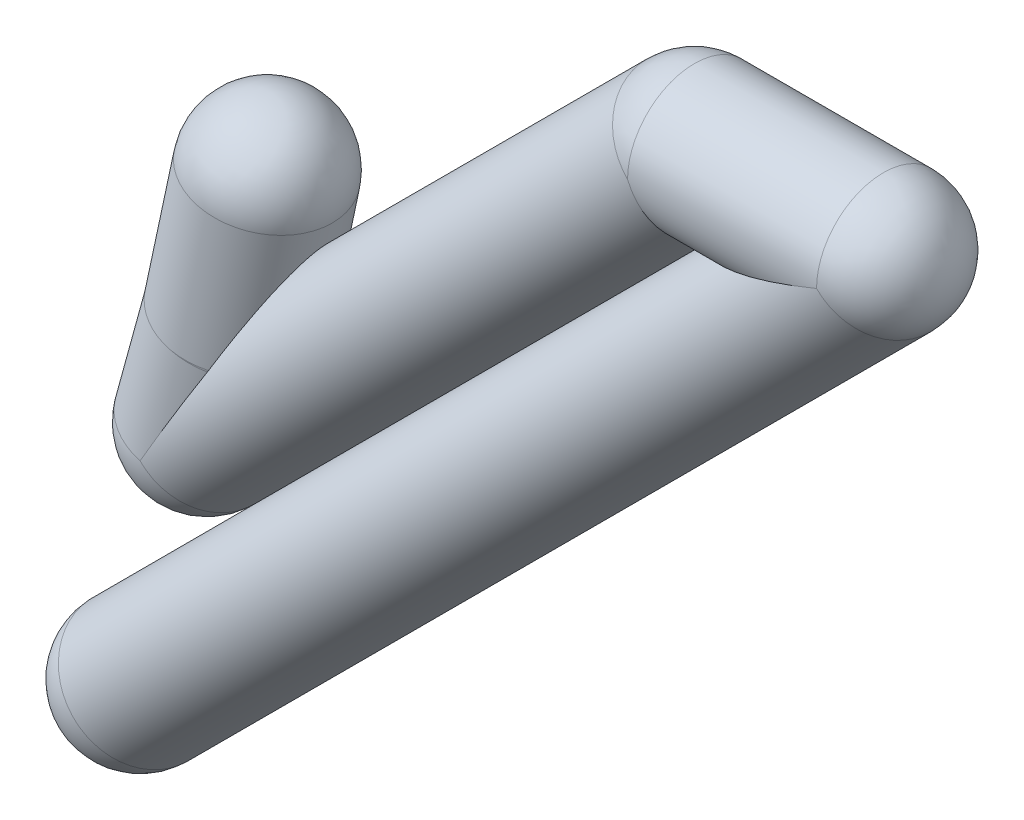
ISO-10303-21;
HEADER;
FILE_DESCRIPTION(('STEP AP214'),'2;1');
FILE_NAME('part.step','',(''),(''),'','','');
FILE_SCHEMA(('AUTOMOTIVE_DESIGN { 1 0 10303 214 1 1 1 1 }'));
ENDSEC;
DATA;
#1=APPLICATION_CONTEXT('core data for automotive mechanical design processes');
#2=APPLICATION_PROTOCOL_DEFINITION('international standard','automotive_design',2000,#1);
#3=PRODUCT_CONTEXT('',#1,'mechanical');
#4=PRODUCT('Part','Part','',(#3));
#5=PRODUCT_RELATED_PRODUCT_CATEGORY('part','',(#4));
#6=PRODUCT_DEFINITION_FORMATION('','',#4);
#7=PRODUCT_DEFINITION_CONTEXT('part definition',#1,'design');
#8=PRODUCT_DEFINITION('design','',#6,#7);
#9=PRODUCT_DEFINITION_SHAPE('','',#8);
#10=(LENGTH_UNIT() NAMED_UNIT(*) SI_UNIT(.MILLI.,.METRE.));
#11=(NAMED_UNIT(*) PLANE_ANGLE_UNIT() SI_UNIT($,.RADIAN.));
#12=(NAMED_UNIT(*) SI_UNIT($,.STERADIAN.) SOLID_ANGLE_UNIT());
#13=UNCERTAINTY_MEASURE_WITH_UNIT(LENGTH_MEASURE(1.E-05),#10,'distance_accuracy_value','');
#14=(GEOMETRIC_REPRESENTATION_CONTEXT(3) GLOBAL_UNCERTAINTY_ASSIGNED_CONTEXT((#13)) GLOBAL_UNIT_ASSIGNED_CONTEXT((#10,
#11,#12)) REPRESENTATION_CONTEXT('',''));
#15=CARTESIAN_POINT('',(0.,0.,0.));
#16=DIRECTION('',(0.,0.,1.));
#17=DIRECTION('',(1.,0.,0.));
#18=AXIS2_PLACEMENT_3D('',#15,#16,#17);
#19=CARTESIAN_POINT('',(12.435,-1.175,0.525));
#20=DIRECTION('',(1.,0.,0.));
#21=DIRECTION('',(0.,-1.,0.));
#22=AXIS2_PLACEMENT_3D('',#19,#20,#21);
#23=SPHERICAL_SURFACE('',#22,0.24);
#24=CARTESIAN_POINT('',(12.435,-1.175,0.525));
#25=DIRECTION('',(-0.706974177949316,-0.707239359561449,0.));
#26=DIRECTION('',(0.707239359561449,-0.706974177949316,0.));
#27=AXIS2_PLACEMENT_3D('',#24,#25,#26);
#28=SPHERICAL_SURFACE('',#27,0.24);
#29=CARTESIAN_POINT('',(12.435,-1.175,0.525));
#30=DIRECTION('',(-0.706974177949316,-0.707239359561449,0.));
#31=DIRECTION('',(0.707239359561449,-0.706974177949316,0.));
#32=AXIS2_PLACEMENT_3D('',#29,#30,#31);
#33=CIRCLE('',#32,0.24);
#34=CARTESIAN_POINT('',(12.6047374462947,-1.34467380270784,0.525));
#35=VERTEX_POINT('',#34);
#36=EDGE_CURVE('E191',#35,#35,#33,.F.);
#37=ORIENTED_EDGE('',*,*,#36,.F.);
#38=EDGE_LOOP('',(#37));
#39=FACE_BOUND('',#38,.T.);
#40=ADVANCED_FACE('F63',(#39),#28,.T.);
#41=CARTESIAN_POINT('',(15.101,1.492,0.525));
#42=DIRECTION('',(-0.706974177949316,-0.707239359561449,0.));
#43=DIRECTION('',(0.707239359561449,-0.706974177949316,0.));
#44=AXIS2_PLACEMENT_3D('',#41,#42,#43);
#45=CYLINDRICAL_SURFACE('',#44,0.24);
#46=CARTESIAN_POINT('',(15.101,1.492,0.525));
#47=DIRECTION('',(0.382770049801891,-0.923843649637025,0.));
#48=DIRECTION('',(-0.923843649637025,-0.382770049801891,0.));
#49=AXIS2_PLACEMENT_3D('',#46,#47,#48);
#50=ELLIPSE('',#49,0.627008304657629,0.24);
#51=CARTESIAN_POINT('',(15.101,1.492,0.285));
#52=VERTEX_POINT('',#51);
#53=CARTESIAN_POINT('',(14.5223132753196,1.25223654379976,0.51434706280173));
#54=VERTEX_POINT('',#53);
#55=EDGE_CURVE('E12',#52,#54,#50,.F.);
#56=ORIENTED_EDGE('',*,*,#55,.F.);
#57=CARTESIAN_POINT('',(15.101,1.492,0.525));
#58=DIRECTION('',(-0.706974177949316,-0.70723935956145,0.));
#59=DIRECTION('',(0.70723935956145,-0.706974177949316,0.));
#60=AXIS2_PLACEMENT_3D('',#57,#58,#59);
#61=CIRCLE('',#60,0.24);
#62=CARTESIAN_POINT('',(15.101,1.492,0.765));
#63=VERTEX_POINT('',#62);
#64=EDGE_CURVE('E227',#52,#63,#61,.T.);
#65=ORIENTED_EDGE('',*,*,#64,.T.);
#66=CARTESIAN_POINT('',(14.5223132753196,1.25223654379976,0.53565293719827));
#67=VERTEX_POINT('',#66);
#68=EDGE_CURVE('E66',#67,#63,#50,.F.);
#69=ORIENTED_EDGE('',*,*,#68,.F.);
#70=CARTESIAN_POINT('',(14.9314682197368,1.66146821379146,0.536811011603823));
#71=CARTESIAN_POINT('',(14.818342736079,1.54832151715807,0.53648822407819));
#72=CARTESIAN_POINT('',(14.7052163180331,1.43517388554659,0.536176825990138));
#73=CARTESIAN_POINT('',(14.1395818946476,0.869433392364671,0.534588605071441));
#74=CARTESIAN_POINT('',(13.6870671805128,0.416833816147703,0.533218091578876));
#75=CARTESIAN_POINT('',(13.1214537669245,-0.148885666865595,0.529969189351214));
#76=CARTESIAN_POINT('',(13.0083325481282,-0.262028099144532,0.529242620622932));
#77=CARTESIAN_POINT('',(12.8669184797733,-0.403468686771588,0.527887374108449));
#78=CARTESIAN_POINT('',(12.8386350322991,-0.431757438222424,0.527593972948655));
#79=CARTESIAN_POINT('',(12.7962215950737,-0.47417882921051,0.526911692366228));
#80=CARTESIAN_POINT('',(12.782085726174,-0.488317348999659,0.526643902030423));
#81=CARTESIAN_POINT('',(12.7608676213383,-0.509539432851651,0.526232529616032));
#82=CARTESIAN_POINT('',(12.7537925004044,-0.516615880578035,0.52609379026819));
#83=CARTESIAN_POINT('',(12.7449690660359,-0.525440969598998,0.525633277264251));
#84=CARTESIAN_POINT('',(12.7432053795274,-0.527204986850387,0.525526818522418));
#85=CARTESIAN_POINT('',(12.7405492381258,-0.529861626356359,0.525388538377581));
#86=CARTESIAN_POINT('',(12.7396619521005,-0.530749078773763,0.525346008108497));
#87=CARTESIAN_POINT('',(12.738744420125,-0.531666782813382,0.525132799293163));
#88=CARTESIAN_POINT('',(12.7386983807486,-0.531712830823511,0.525121643383809));
#89=CARTESIAN_POINT('',(12.7386088367141,-0.531802391650164,0.525096471003958));
#90=CARTESIAN_POINT('',(12.73856532422,-0.531845912304088,0.525082632514652));
#91=CARTESIAN_POINT('',(12.7385155956223,-0.531895650227423,0.525055706879124));
#92=CARTESIAN_POINT('',(12.7385073560996,-0.531903891295278,0.525050852574643));
#93=CARTESIAN_POINT('',(12.7384953540412,-0.531915895604354,0.525042721873144));
#94=CARTESIAN_POINT('',(12.7384914413275,-0.531919809051862,0.525039894731013));
#95=CARTESIAN_POINT('',(12.738483970479,-0.5319272813013,0.525033485288411));
#96=CARTESIAN_POINT('',(12.7384804083917,-0.531930844056586,0.525029913296996));
#97=CARTESIAN_POINT('',(12.7384756085464,-0.531935644802065,0.525023671017809));
#98=CARTESIAN_POINT('',(12.7384740948456,-0.531937158786741,0.52502143354888));
#99=CARTESIAN_POINT('',(12.7384712938095,-0.531939960348086,0.525016625485724));
#100=CARTESIAN_POINT('',(12.7384700110018,-0.531941243396375,0.525014049653961));
#101=CARTESIAN_POINT('',(12.7384688919098,-0.531942362698171,0.525011325119833));
#102=B_SPLINE_CURVE_WITH_KNOTS('',3,(#70,#71,#72,#73,#74,#75,#76,#77,#78,#79,#80,#81,#82,#83,
#84,#85,#86,#87,#88,#89,#90,#91,#92,#93,#94,#95,#96,#97,#98,#99,#100,#101),.UNSPECIFIED.,.F.,
.F.,(4,2,2,2,2,2,2,2,2,2,2,2,2,2,2,4),(0.,0.480000001542519,2.40000041882713,2.88000072135492,
3.00000083409713,3.0600009937003,3.09000137629971,3.09750160234522,3.1012528666637,
3.10145123988982,3.10163934379734,3.10167716448715,3.10169579358843,3.10171418019193,
3.10172343802015,3.10173286125264),.UNSPECIFIED.);
#103=CARTESIAN_POINT('',(12.8436957607435,-0.426695760743489,0.527587966649211));
#104=VERTEX_POINT('',#103);
#105=EDGE_CURVE('E190',#104,#67,#102,.F.);
#106=ORIENTED_EDGE('',*,*,#105,.F.);
#107=CARTESIAN_POINT('',(12.8439056274091,-0.426485724831392,0.522417974999879));
#108=CARTESIAN_POINT('',(12.8437558175882,-0.426635752871597,0.522407773957747));
#109=CARTESIAN_POINT('',(12.843605380402,-0.426786201255201,0.522410385210847));
#110=CARTESIAN_POINT('',(12.8433049697176,-0.42708624088367,0.522442026969652));
#111=CARTESIAN_POINT('',(12.8431550021993,-0.427235824201112,0.52247118816671));
#112=CARTESIAN_POINT('',(12.8428586155294,-0.427531067230299,0.522556888200124));
#113=CARTESIAN_POINT('',(12.8427122005311,-0.427676722369824,0.522613457599648));
#114=CARTESIAN_POINT('',(12.8424265232817,-0.427960565122965,0.522755699890893));
#115=CARTESIAN_POINT('',(12.8422872510151,-0.428098763207857,0.522841330672945));
#116=CARTESIAN_POINT('',(12.8420492256553,-0.428334684829822,0.52302222006667));
#117=CARTESIAN_POINT('',(12.841948199591,-0.428434721414624,0.523111448516408));
#118=CARTESIAN_POINT('',(12.841756798195,-0.428624095751775,0.523310503694778));
#119=CARTESIAN_POINT('',(12.8416664105508,-0.428713445874355,0.523420306222085));
#120=CARTESIAN_POINT('',(12.8415195712046,-0.428858501244034,0.523634132884425));
#121=CARTESIAN_POINT('',(12.841460050616,-0.428917262170435,0.523733958723999));
#122=CARTESIAN_POINT('',(12.8413531537831,-0.429022751060096,0.523945783771212));
#123=CARTESIAN_POINT('',(12.8413057619872,-0.429069494432809,0.524057767125078));
#124=CARTESIAN_POINT('',(12.8412328376988,-0.429141399516104,0.524273029205988));
#125=CARTESIAN_POINT('',(12.8412050033806,-0.429168835046392,0.524374760525435));
#126=CARTESIAN_POINT('',(12.8411618457487,-0.429211368603443,0.524583348138746));
#127=CARTESIAN_POINT('',(12.8411465148304,-0.429226474129414,0.524690201275545));
#128=CARTESIAN_POINT('',(12.8411294766015,-0.429243261608478,0.524906405058662));
#129=CARTESIAN_POINT('',(12.8411278129924,-0.429244900501768,0.525015762596085));
#130=CARTESIAN_POINT('',(12.8411383529091,-0.429234515978236,0.525233146125954));
#131=CARTESIAN_POINT('',(12.8411505578406,-0.4292224911765,0.525341171982303));
#132=CARTESIAN_POINT('',(12.8411870017847,-0.42918657725018,0.525547562299485));
#133=CARTESIAN_POINT('',(12.8412106349595,-0.429163285398802,0.525646141611338));
#134=CARTESIAN_POINT('',(12.8412681637254,-0.429106569872343,0.525837154699115));
#135=CARTESIAN_POINT('',(12.8413020635197,-0.429073142047562,0.525929585939064));
#136=CARTESIAN_POINT('',(12.8413932609922,-0.428983180331816,0.526141247590385));
#137=CARTESIAN_POINT('',(12.8414545417689,-0.428922705726911,0.526257090312211));
#138=CARTESIAN_POINT('',(12.8415895886472,-0.428789347624404,0.526473304368835));
#139=CARTESIAN_POINT('',(12.8416633787629,-0.428716440258149,0.526573645223073));
#140=CARTESIAN_POINT('',(12.8418493403319,-0.428532566984293,0.526793435564315));
#141=CARTESIAN_POINT('',(12.8419655613459,-0.428417549096339,0.526906051133773));
#142=CARTESIAN_POINT('',(12.8422090607881,-0.428176297011657,0.527103941762975));
#143=CARTESIAN_POINT('',(12.8423363607114,-0.428050040999553,0.527189162097231));
#144=CARTESIAN_POINT('',(12.8426425940774,-0.427745955526829,0.527358949371632));
#145=CARTESIAN_POINT('',(12.8428243050934,-0.427565247092582,0.527433339147737));
#146=CARTESIAN_POINT('',(12.8431932310079,-0.427197741072887,0.527539706716946));
#147=CARTESIAN_POINT('',(12.8433804421488,-0.427010947635521,0.527571712807345));
#148=CARTESIAN_POINT('',(12.8436806056503,-0.426710956288951,0.527590158479851));
#149=CARTESIAN_POINT('',(12.8437933070486,-0.426598207813292,0.527589703873691));
#150=CARTESIAN_POINT('',(12.843905627409,-0.426485724831483,0.527582025001836));
#151=B_SPLINE_CURVE_WITH_KNOTS('',3,(#107,#108,#109,#110,#111,#112,#113,#114,#115,#116,#117,
#118,#119,#120,#121,#122,#123,#124,#125,#126,#127,#128,#129,#130,#131,#132,#133,#134,#135,#136,
#137,#138,#139,#140,#141,#142,#143,#144,#145,#146,#147,#148,#149,#150),.UNSPECIFIED.,.F.,.F.,(4,
2,2,2,2,2,2,2,2,2,2,2,2,2,2,2,2,2,2,2,2,4),(0.,0.000636595524471061,0.00127634171523664,
0.0019168029411628,0.00255634007915401,0.00305835063383605,0.00355977433819105,
0.00394907332080322,0.00433787060860846,0.00466342029979467,0.00498877184119542,
0.0053151632968582,0.00564158783760799,0.00595234198032088,0.00626322351897469,
0.00669382772166071,0.00712526811013135,0.00771764439157067,0.00831119677115244,
0.00910760295977434,0.00990347716251675,0.0103809943925999),.UNSPECIFIED.);
#152=CARTESIAN_POINT('',(12.8436957607435,-0.426695760743489,0.522412033346073));
#153=VERTEX_POINT('',#152);
#154=EDGE_CURVE('E183',#153,#104,#151,.T.);
#155=ORIENTED_EDGE('',*,*,#154,.F.);
#156=CARTESIAN_POINT('',(14.9314682197368,1.66146821379146,0.513188988396177));
#157=CARTESIAN_POINT('',(14.818342736079,1.54832151715807,0.51351177592181));
#158=CARTESIAN_POINT('',(14.7052163180331,1.43517388554659,0.513823174009863));
#159=CARTESIAN_POINT('',(14.1395818946476,0.869433392364671,0.515411394928559));
#160=CARTESIAN_POINT('',(13.6870671805128,0.416833816147703,0.516781908421124));
#161=CARTESIAN_POINT('',(13.1214537669245,-0.148885666865595,0.520030810648786));
#162=CARTESIAN_POINT('',(13.0083325481282,-0.262028099144532,0.520757379377069));
#163=CARTESIAN_POINT('',(12.8669184797733,-0.403468686771588,0.522112625891551));
#164=CARTESIAN_POINT('',(12.8386350322991,-0.431757438222424,0.522406027051345));
#165=CARTESIAN_POINT('',(12.7962215950737,-0.47417882921051,0.523088307633773));
#166=CARTESIAN_POINT('',(12.782085726174,-0.488317348999659,0.523356097969577));
#167=CARTESIAN_POINT('',(12.7608676213383,-0.509539432851651,0.523767470383968));
#168=CARTESIAN_POINT('',(12.7537925004044,-0.516615880578035,0.52390620973181));
#169=CARTESIAN_POINT('',(12.7449690660359,-0.525440969598998,0.524366722735749));
#170=CARTESIAN_POINT('',(12.7432053795274,-0.527204986850387,0.524473181477583));
#171=CARTESIAN_POINT('',(12.7405492381258,-0.529861626356359,0.524611461622419));
#172=CARTESIAN_POINT('',(12.7396619521005,-0.530749078773763,0.524653991891503));
#173=CARTESIAN_POINT('',(12.738744420125,-0.531666782813382,0.524867200706837));
#174=CARTESIAN_POINT('',(12.7386983807486,-0.531712830823511,0.524878356616191));
#175=CARTESIAN_POINT('',(12.7386088367141,-0.531802391650164,0.524903528996042));
#176=CARTESIAN_POINT('',(12.73856532422,-0.531845912304088,0.524917367485348));
#177=CARTESIAN_POINT('',(12.7385155956223,-0.531895650227423,0.524944293120876));
#178=CARTESIAN_POINT('',(12.7385073560996,-0.531903891295278,0.524949147425357));
#179=CARTESIAN_POINT('',(12.7384953540412,-0.531915895604354,0.524957278126856));
#180=CARTESIAN_POINT('',(12.7384914413275,-0.531919809051862,0.524960105268987));
#181=CARTESIAN_POINT('',(12.738483970479,-0.5319272813013,0.52496651471159));
#182=CARTESIAN_POINT('',(12.7384804083917,-0.531930844056586,0.524970086703005));
#183=CARTESIAN_POINT('',(12.7384756085464,-0.531935644802065,0.524976328982191));
#184=CARTESIAN_POINT('',(12.7384740948456,-0.531937158786741,0.52497856645112));
#185=CARTESIAN_POINT('',(12.7384712938095,-0.531939960348086,0.524983374514276));
#186=CARTESIAN_POINT('',(12.7384700110018,-0.531941243396375,0.52498595034604));
#187=CARTESIAN_POINT('',(12.7384688919098,-0.531942362698171,0.524988674880167));
#188=B_SPLINE_CURVE_WITH_KNOTS('',3,(#156,#157,#158,#159,#160,#161,#162,#163,#164,#165,#166,
#167,#168,#169,#170,#171,#172,#173,#174,#175,#176,#177,#178,#179,#180,#181,#182,#183,#184,#185,
#186,#187),.UNSPECIFIED.,.F.,.F.,(4,2,2,2,2,2,2,2,2,2,2,2,2,2,2,4),(0.,0.480000001542519,
2.40000041882713,2.88000072135492,3.00000083409713,3.0600009937003,3.09000137629971,
3.09750160234522,3.1012528666637,3.10145123988982,3.10163934379734,3.10167716448715,
3.10169579358843,3.10171418019193,3.10172343802015,3.10173286125264),.UNSPECIFIED.);
#189=EDGE_CURVE('E77',#54,#153,#188,.T.);
#190=ORIENTED_EDGE('',*,*,#189,.F.);
#191=EDGE_LOOP('',(#56,#65,#69,#106,#155,#190));
#192=FACE_BOUND('',#191,.T.);
#193=ORIENTED_EDGE('',*,*,#36,.T.);
#194=EDGE_LOOP('',(#193));
#195=FACE_BOUND('',#194,.T.);
#196=ADVANCED_FACE('F196',(#192,#195),#45,.T.);
#197=CARTESIAN_POINT('',(15.101,1.492,0.525));
#198=DIRECTION('',(1.,0.,0.));
#199=DIRECTION('',(0.,-1.,0.));
#200=AXIS2_PLACEMENT_3D('',#197,#198,#199);
#201=SPHERICAL_SURFACE('',#200,0.24);
#202=ORIENTED_EDGE('',*,*,#64,.F.);
#203=CARTESIAN_POINT('',(15.101,1.492,0.525));
#204=DIRECTION('',(1.,0.,0.));
#205=DIRECTION('',(0.,0.,-1.));
#206=AXIS2_PLACEMENT_3D('',#203,#204,#205);
#207=CIRCLE('',#206,0.24);
#208=EDGE_CURVE('E225',#63,#52,#207,.F.);
#209=ORIENTED_EDGE('',*,*,#208,.F.);
#210=EDGE_LOOP('',(#202,#209));
#211=FACE_BOUND('',#210,.T.);
#212=ADVANCED_FACE('F200',(#211),#201,.T.);
#213=CARTESIAN_POINT('',(14.423,1.492,0.525));
#214=DIRECTION('',(1.,0.,0.));
#215=DIRECTION('',(0.,0.,-1.));
#216=AXIS2_PLACEMENT_3D('',#213,#214,#215);
#217=CYLINDRICAL_SURFACE('',#216,0.24);
#218=ORIENTED_EDGE('',*,*,#208,.T.);
#219=ORIENTED_EDGE('',*,*,#55,.T.);
#220=CARTESIAN_POINT('',(14.423,1.492,0.525));
#221=DIRECTION('',(0.923879532511287,0.38268343236509,0.));
#222=DIRECTION('',(0.38268343236509,-0.923879532511287,0.));
#223=AXIS2_PLACEMENT_3D('',#220,#221,#222);
#224=ELLIPSE('',#223,0.259774128070175,0.24);
#225=CARTESIAN_POINT('',(14.423,1.492,0.285));
#226=VERTEX_POINT('',#225);
#227=EDGE_CURVE('E224',#226,#54,#224,.F.);
#228=ORIENTED_EDGE('',*,*,#227,.F.);
#229=CARTESIAN_POINT('',(14.423,1.492,0.525));
#230=DIRECTION('',(1.,0.,0.));
#231=DIRECTION('',(0.,0.,-1.));
#232=AXIS2_PLACEMENT_3D('',#229,#230,#231);
#233=CIRCLE('',#232,0.24);
#234=CARTESIAN_POINT('',(14.423,1.492,0.765));
#235=VERTEX_POINT('',#234);
#236=EDGE_CURVE('E222',#226,#235,#233,.T.);
#237=ORIENTED_EDGE('',*,*,#236,.T.);
#238=EDGE_CURVE('E213',#67,#235,#224,.F.);
#239=ORIENTED_EDGE('',*,*,#238,.F.);
#240=ORIENTED_EDGE('',*,*,#68,.T.);
#241=EDGE_LOOP('',(#218,#219,#228,#237,#239,#240));
#242=FACE_BOUND('',#241,.T.);
#243=ADVANCED_FACE('F219',(#242),#217,.T.);
#244=CARTESIAN_POINT('',(14.423,1.492,0.525));
#245=DIRECTION('',(1.,0.,0.));
#246=DIRECTION('',(0.,-1.,0.));
#247=AXIS2_PLACEMENT_3D('',#244,#245,#246);
#248=SPHERICAL_SURFACE('',#247,0.24);
#249=ORIENTED_EDGE('',*,*,#236,.F.);
#250=CARTESIAN_POINT('',(14.423,1.492,0.525));
#251=DIRECTION('',(0.707106781186548,0.707106781186547,0.));
#252=DIRECTION('',(-0.707106781186547,0.707106781186548,0.));
#253=AXIS2_PLACEMENT_3D('',#250,#251,#252);
#254=CIRCLE('',#253,0.24);
#255=EDGE_CURVE('E334',#235,#226,#254,.F.);
#256=ORIENTED_EDGE('',*,*,#255,.F.);
#257=EDGE_LOOP('',(#249,#256));
#258=FACE_BOUND('',#257,.T.);
#259=ADVANCED_FACE('F253',(#258),#248,.T.);
#260=CARTESIAN_POINT('',(12.674,-0.257,0.525));
#261=DIRECTION('',(0.707106781186548,0.707106781186547,0.));
#262=DIRECTION('',(-0.707106781186547,0.707106781186548,0.));
#263=AXIS2_PLACEMENT_3D('',#260,#261,#262);
#264=CYLINDRICAL_SURFACE('',#263,0.24);
#265=ORIENTED_EDGE('',*,*,#227,.T.);
#266=ORIENTED_EDGE('',*,*,#189,.T.);
#267=CARTESIAN_POINT('',(12.674,-0.257,0.525));
#268=DIRECTION('',(0.707106781186548,0.707106781186547,0.));
#269=DIRECTION('',(-0.707106781186547,0.707106781186548,0.));
#270=AXIS2_PLACEMENT_3D('',#267,#268,#269);
#271=CIRCLE('',#270,0.24);
#272=CARTESIAN_POINT('',(12.674,-0.257000000000007,0.285));
#273=VERTEX_POINT('',#272);
#274=EDGE_CURVE('E154',#153,#273,#271,.T.);
#275=ORIENTED_EDGE('',*,*,#274,.T.);
#276=CARTESIAN_POINT('',(12.674,-0.256999999999998,0.525));
#277=DIRECTION('',(0.864803643058402,-0.502110205983624,0.));
#278=DIRECTION('',(0.502110205983623,0.864803643058402,0.));
#279=AXIS2_PLACEMENT_3D('',#276,#277,#278);
#280=ELLIPSE('',#279,0.935807545090937,0.24);
#281=CARTESIAN_POINT('',(12.8888696431356,0.113078217789852,0.311563477406266));
#282=VERTEX_POINT('',#281);
#283=EDGE_CURVE('E357',#282,#273,#280,.F.);
#284=ORIENTED_EDGE('',*,*,#283,.F.);
#285=CARTESIAN_POINT('',(12.9186698671729,0.192296705124994,0.333521728139037));
#286=CARTESIAN_POINT('',(12.916281423366,0.181329920028388,0.328935527130275));
#287=CARTESIAN_POINT('',(12.913274209106,0.170182861785299,0.325042652123825));
#288=CARTESIAN_POINT('',(12.9058847816894,0.148303257976919,0.318606036165927));
#289=CARTESIAN_POINT('',(12.9015399345813,0.137567426350744,0.316030161871049));
#290=CARTESIAN_POINT('',(12.8921572469805,0.118537115963306,0.312329859268076));
#291=CARTESIAN_POINT('',(12.8873816506484,0.110148990592028,0.311028395358101));
#292=CARTESIAN_POINT('',(12.8766137661474,0.0938481533453814,0.309090899036354));
#293=CARTESIAN_POINT('',(12.870597476243,0.0859495819526134,0.308469810951777));
#294=CARTESIAN_POINT('',(12.8639989504067,0.0785286335063749,0.308180822646033));
#295=B_SPLINE_CURVE_WITH_KNOTS('',3,(#285,#286,#287,#288,#289,#290,#291,#292,#293,#294),
.UNSPECIFIED.,.F.,.F.,(4,2,2,2,4),(0.,0.0363773611805648,0.0718188172288339,0.100932264135757,
0.13067310079251),.UNSPECIFIED.);
#296=CARTESIAN_POINT('',(12.892005467653,0.118657415007651,0.312460752453492));
#297=VERTEX_POINT('',#296);
#298=EDGE_CURVE('E130',#297,#282,#295,.T.);
#299=ORIENTED_EDGE('',*,*,#298,.F.);
#300=CARTESIAN_POINT('',(12.7039768637532,-0.22702313624679,0.525));
#301=DIRECTION('',(0.878455208795632,-0.477824702312284,0.));
#302=DIRECTION('',(0.477824702312283,0.878455208795632,0.));
#303=AXIS2_PLACEMENT_3D('',#300,#301,#302);
#304=ELLIPSE('',#303,0.847192736141898,0.24);
#305=CARTESIAN_POINT('',(12.892005467653,0.118657415007651,0.737539247546508));
#306=VERTEX_POINT('',#305);
#307=EDGE_CURVE('E145',#306,#297,#304,.F.);
#308=ORIENTED_EDGE('',*,*,#307,.F.);
#309=CARTESIAN_POINT('',(12.8639989504067,0.0785286335063739,0.741819177353964));
#310=CARTESIAN_POINT('',(12.8720590277675,0.0875711131736288,0.741464708433878));
#311=CARTESIAN_POINT('',(12.8792302376777,0.0973286286637633,0.740619516833243));
#312=CARTESIAN_POINT('',(12.8917102472891,0.117502746087181,0.737883994505503));
#313=CARTESIAN_POINT('',(12.8970611838446,0.127896727691657,0.736020362886681));
#314=CARTESIAN_POINT('',(12.9054230022826,0.147252121124659,0.73159290327238));
#315=CARTESIAN_POINT('',(12.908678223025,0.15615178585341,0.729205051359772));
#316=CARTESIAN_POINT('',(12.9143270320644,0.174170152269831,0.723538820145746));
#317=CARTESIAN_POINT('',(12.9167008151692,0.183289485662216,0.720242575230994));
#318=CARTESIAN_POINT('',(12.9186698671729,0.192296705124995,0.716478271860964));
#319=B_SPLINE_CURVE_WITH_KNOTS('',3,(#309,#310,#311,#312,#313,#314,#315,#316,#317,#318),
.UNSPECIFIED.,.F.,.F.,(4,2,2,2,4),(0.,0.0362348954263537,0.0715625061213349,0.100803009624681,
0.130665621374331),.UNSPECIFIED.);
#320=CARTESIAN_POINT('',(12.8888696431339,0.113078217790495,0.738436522592856));
#321=VERTEX_POINT('',#320);
#322=EDGE_CURVE('E337',#321,#306,#319,.T.);
#323=ORIENTED_EDGE('',*,*,#322,.F.);
#324=CARTESIAN_POINT('',(12.674,-0.257000000000007,0.765));
#325=VERTEX_POINT('',#324);
#326=EDGE_CURVE('E358',#325,#321,#280,.F.);
#327=ORIENTED_EDGE('',*,*,#326,.F.);
#328=EDGE_CURVE('E216',#325,#104,#271,.T.);
#329=ORIENTED_EDGE('',*,*,#328,.T.);
#330=ORIENTED_EDGE('',*,*,#105,.T.);
#331=ORIENTED_EDGE('',*,*,#238,.T.);
#332=ORIENTED_EDGE('',*,*,#255,.T.);
#333=EDGE_LOOP('',(#265,#266,#275,#284,#299,#308,#323,#327,#329,#330,#331,#332));
#334=FACE_BOUND('',#333,.T.);
#335=ADVANCED_FACE('F178',(#334),#264,.T.);
#336=CARTESIAN_POINT('',(12.674,-0.257,0.525));
#337=DIRECTION('',(1.,0.,0.));
#338=DIRECTION('',(0.,-1.,0.));
#339=AXIS2_PLACEMENT_3D('',#336,#337,#338);
#340=SPHERICAL_SURFACE('',#339,0.24);
#341=ORIENTED_EDGE('',*,*,#274,.F.);
#342=ORIENTED_EDGE('',*,*,#154,.T.);
#343=ORIENTED_EDGE('',*,*,#328,.F.);
#344=CARTESIAN_POINT('',(12.674,-0.257,0.525));
#345=DIRECTION('',(-0.263526527056736,-0.964652149501267,0.));
#346=DIRECTION('',(0.964652149501267,-0.263526527056737,0.));
#347=AXIS2_PLACEMENT_3D('',#344,#345,#346);
#348=CIRCLE('',#347,0.24);
#349=EDGE_CURVE('E134',#273,#325,#348,.F.);
#350=ORIENTED_EDGE('',*,*,#349,.F.);
#351=EDGE_LOOP('',(#341,#342,#343,#350));
#352=FACE_BOUND('',#351,.T.);
#353=ADVANCED_FACE('F174',(#352),#340,.T.);
#354=CARTESIAN_POINT('',(12.783,0.142,0.525));
#355=DIRECTION('',(1.,0.,0.));
#356=DIRECTION('',(0.,-1.,0.));
#357=AXIS2_PLACEMENT_3D('',#354,#355,#356);
#358=SPHERICAL_SURFACE('',#357,0.24);
#359=CARTESIAN_POINT('',(12.783,0.142000000000001,0.525));
#360=DIRECTION('',(-0.209394180223832,-0.977831313309402,0.));
#361=DIRECTION('',(0.977831313309402,-0.209394180223832,0.));
#362=AXIS2_PLACEMENT_3D('',#359,#360,#361);
#363=CIRCLE('',#362,0.24);
#364=CARTESIAN_POINT('',(12.783,0.142000000000002,0.285));
#365=VERTEX_POINT('',#364);
#366=EDGE_CURVE('E129',#365,#297,#363,.T.);
#367=ORIENTED_EDGE('',*,*,#366,.T.);
#368=ORIENTED_EDGE('',*,*,#298,.T.);
#369=CARTESIAN_POINT('',(12.783,0.142,0.525));
#370=DIRECTION('',(-0.263526527056733,-0.964652149501268,0.));
#371=DIRECTION('',(0.964652149501268,-0.263526527056733,0.));
#372=AXIS2_PLACEMENT_3D('',#369,#370,#371);
#373=CIRCLE('',#372,0.24);
#374=EDGE_CURVE('E126',#365,#282,#373,.T.);
#375=ORIENTED_EDGE('',*,*,#374,.F.);
#376=EDGE_LOOP('',(#367,#368,#375));
#377=FACE_BOUND('',#376,.T.);
#378=ADVANCED_FACE('F128',(#377),#358,.T.);
#379=CARTESIAN_POINT('',(12.783,0.142,0.525));
#380=DIRECTION('',(-0.263526527056736,-0.964652149501267,0.));
#381=DIRECTION('',(0.964652149501267,-0.263526527056737,0.));
#382=AXIS2_PLACEMENT_3D('',#379,#380,#381);
#383=CYLINDRICAL_SURFACE('',#382,0.24);
#384=ORIENTED_EDGE('',*,*,#349,.T.);
#385=ORIENTED_EDGE('',*,*,#326,.T.);
#386=CARTESIAN_POINT('',(12.783,0.142000000000003,0.765));
#387=VERTEX_POINT('',#386);
#388=EDGE_CURVE('E135',#321,#387,#373,.T.);
#389=ORIENTED_EDGE('',*,*,#388,.T.);
#390=CARTESIAN_POINT('',(12.783,0.141999999999934,0.765));
#391=CARTESIAN_POINT('',(12.7791830228406,0.142929288602152,0.765000083419049));
#392=CARTESIAN_POINT('',(12.7753664563857,0.143860236183995,0.764903622430109));
#393=CARTESIAN_POINT('',(12.7677433474358,0.145722938239255,0.764518201076695));
#394=CARTESIAN_POINT('',(12.7639368047073,0.146654692693196,0.764229245235575));
#395=CARTESIAN_POINT('',(12.756342851871,0.148516520161334,0.763459432320267));
#396=CARTESIAN_POINT('',(12.7525554413301,0.149446593213286,0.762978579610219));
#397=CARTESIAN_POINT('',(12.7450088120424,0.15130258306231,0.76182615784031));
#398=CARTESIAN_POINT('',(12.7412495926778,0.152228499950303,0.761154592973349));
#399=CARTESIAN_POINT('',(12.7337683406453,0.154073720214874,0.759622357882481));
#400=CARTESIAN_POINT('',(12.7300463071896,0.154993023731418,0.758761691672949));
#401=CARTESIAN_POINT('',(12.7226483340502,0.156822583989213,0.75685332939216));
#402=CARTESIAN_POINT('',(12.7189723934245,0.15773284091526,0.755805637149655));
#403=CARTESIAN_POINT('',(12.7116754042407,0.159541904444929,0.753525746472728));
#404=CARTESIAN_POINT('',(12.708054354602,0.160440711273907,0.752293551675715));
#405=CARTESIAN_POINT('',(12.7008758155775,0.162224506606278,0.749647624688708));
#406=CARTESIAN_POINT('',(12.6973183249883,0.163109495371271,0.74823389594014));
#407=CARTESIAN_POINT('',(12.6902754212913,0.16486332781127,0.745228307012126));
#408=CARTESIAN_POINT('',(12.6867900068731,0.165732171779777,0.743636450074637));
#409=CARTESIAN_POINT('',(12.6798996012623,0.167451434709113,0.740278439906012));
#410=CARTESIAN_POINT('',(12.6764946086682,0.168301853991001,0.738512289715015));
#411=CARTESIAN_POINT('',(12.6697732008618,0.169982039967856,0.73480994805352));
#412=CARTESIAN_POINT('',(12.6664567841729,0.17081180700711,0.732873759420127));
#413=CARTESIAN_POINT('',(12.6599204711013,0.172448518624439,0.728836005529195));
#414=CARTESIAN_POINT('',(12.6567005731825,0.173255463565734,0.726734442905634));
#415=CARTESIAN_POINT('',(12.6503650102088,0.174844424045149,0.722371004088562));
#416=CARTESIAN_POINT('',(12.6472493435738,0.175626439961172,0.720109130326907));
#417=CARTESIAN_POINT('',(12.6411297067789,0.177163503456031,0.715430518489854));
#418=CARTESIAN_POINT('',(12.6381257350101,0.177918551423276,0.713013782646284));
#419=CARTESIAN_POINT('',(12.6322366846319,0.179399713006405,0.708031268974996));
#420=CARTESIAN_POINT('',(12.6293516043999,0.180125827017115,0.70546549318223));
#421=CARTESIAN_POINT('',(12.6237072495158,0.181547232329023,0.700191080988545));
#422=CARTESIAN_POINT('',(12.6209479732421,0.182242524027481,0.697482446429884));
#423=CARTESIAN_POINT('',(12.6155618377789,0.183600478561854,0.691928842234759));
#424=CARTESIAN_POINT('',(12.6129349769829,0.184263141793598,0.689083874253042));
#425=CARTESIAN_POINT('',(12.6078199671365,0.185554119797685,0.683264457175417));
#426=CARTESIAN_POINT('',(12.6053318165082,0.186182434960699,0.680290009552893));
#427=CARTESIAN_POINT('',(12.6005001896513,0.18740308792916,0.674218799078226));
#428=CARTESIAN_POINT('',(12.5981567118866,0.187995426116547,0.671122037525176));
#429=CARTESIAN_POINT('',(12.5936200470398,0.189142590858297,0.664813659731274));
#430=CARTESIAN_POINT('',(12.5914268584759,0.189697417782462,0.661602044623177));
#431=CARTESIAN_POINT('',(12.5871960284126,0.190768124041073,0.655071696944691));
#432=CARTESIAN_POINT('',(12.5851583854977,0.191284003729959,0.65175296534951));
#433=CARTESIAN_POINT('',(12.5812435305511,0.19227548133927,0.645016379965987));
#434=CARTESIAN_POINT('',(12.579366317181,0.192751079595743,0.641598527004881));
#435=CARTESIAN_POINT('',(12.5757768208146,0.193660765153433,0.634671932940563));
#436=CARTESIAN_POINT('',(12.5740645365673,0.194094852769481,0.631163192526928));
#437=CARTESIAN_POINT('',(12.5708090027695,0.194920395812528,0.624063276553613));
#438=CARTESIAN_POINT('',(12.5692657520652,0.195311851530537,0.620472101556844));
#439=CARTESIAN_POINT('',(12.5663519846217,0.196051120197691,0.61321596799399));
#440=CARTESIAN_POINT('',(12.5649814668345,0.19639893341165,0.609551009875765));
#441=CARTESIAN_POINT('',(12.5624164505283,0.197050019579271,0.602156139384686));
#442=CARTESIAN_POINT('',(12.5612219510747,0.197353292769416,0.598426227356821));
#443=CARTESIAN_POINT('',(12.5590118348588,0.197914516648313,0.590910434828244));
#444=CARTESIAN_POINT('',(12.5579962172824,0.198172467543331,0.587124554582332));
#445=CARTESIAN_POINT('',(12.5561462994667,0.198642381725523,0.579505946218764));
#446=CARTESIAN_POINT('',(12.5553119985398,0.19885434518711,0.575673218278841));
#447=CARTESIAN_POINT('',(12.5538267140271,0.199231738132755,0.56797014797514));
#448=CARTESIAN_POINT('',(12.5531757298851,0.199397167758003,0.564099805725525));
#449=CARTESIAN_POINT('',(12.5520586394869,0.199681066714105,0.556330830852762));
#450=CARTESIAN_POINT('',(12.5515925328099,0.199799536151824,0.552432198294012));
#451=CARTESIAN_POINT('',(12.5508463146678,0.199989209495681,0.544616034993137));
#452=CARTESIAN_POINT('',(12.5505662029206,0.200060413473526,0.540698504279691));
#453=CARTESIAN_POINT('',(12.5501926460551,0.200155372475272,0.532853982372712));
#454=CARTESIAN_POINT('',(12.5500992007952,0.200179127535167,0.528926991186356));
#455=CARTESIAN_POINT('',(12.5500992007952,0.200179127535167,0.521073008813644));
#456=CARTESIAN_POINT('',(12.5501926460551,0.200155372475272,0.517146017627289));
#457=CARTESIAN_POINT('',(12.5505662029206,0.200060413473526,0.509301495720309));
#458=CARTESIAN_POINT('',(12.5508463146678,0.199989209495681,0.505383965006864));
#459=CARTESIAN_POINT('',(12.5515925328099,0.199799536151824,0.497567801705989));
#460=CARTESIAN_POINT('',(12.5520586394869,0.199681066714105,0.493669169147239));
#461=CARTESIAN_POINT('',(12.5531757298851,0.199397167758003,0.485900194274475));
#462=CARTESIAN_POINT('',(12.5538267140271,0.199231738132755,0.482029852024861));
#463=CARTESIAN_POINT('',(12.5553119985398,0.19885434518711,0.47432678172116));
#464=CARTESIAN_POINT('',(12.5561462994667,0.198642381725523,0.470494053781237));
#465=CARTESIAN_POINT('',(12.5579962172824,0.198172467543331,0.462875445417668));
#466=CARTESIAN_POINT('',(12.5590118348588,0.197914516648313,0.459089565171756));
#467=CARTESIAN_POINT('',(12.5612219510747,0.197353292769416,0.451573772643179));
#468=CARTESIAN_POINT('',(12.5624164505283,0.197050019579271,0.447843860615315));
#469=CARTESIAN_POINT('',(12.5649814668345,0.19639893341165,0.440448990124236));
#470=CARTESIAN_POINT('',(12.5663519846217,0.196051120197691,0.436784032006011));
#471=CARTESIAN_POINT('',(12.5692657520652,0.195311851530537,0.429527898443157));
#472=CARTESIAN_POINT('',(12.5708090027695,0.194920395812528,0.425936723446387));
#473=CARTESIAN_POINT('',(12.5740645365673,0.194094852769481,0.418836807473073));
#474=CARTESIAN_POINT('',(12.5757768208146,0.193660765153433,0.415328067059438));
#475=CARTESIAN_POINT('',(12.579366317181,0.192751079595743,0.40840147299512));
#476=CARTESIAN_POINT('',(12.5812435305511,0.19227548133927,0.404983620034014));
#477=CARTESIAN_POINT('',(12.5851583854977,0.191284003729959,0.398247034650491));
#478=CARTESIAN_POINT('',(12.5871960284126,0.190768124041073,0.39492830305531));
#479=CARTESIAN_POINT('',(12.5914268584759,0.189697417782462,0.388397955376824));
#480=CARTESIAN_POINT('',(12.5936200470398,0.189142590858297,0.385186340268726));
#481=CARTESIAN_POINT('',(12.5981567118866,0.187995426116547,0.378877962474824));
#482=CARTESIAN_POINT('',(12.6005001896513,0.18740308792916,0.375781200921774));
#483=CARTESIAN_POINT('',(12.6053318165082,0.186182434960699,0.369709990447108));
#484=CARTESIAN_POINT('',(12.6078199671365,0.185554119797685,0.366735542824583));
#485=CARTESIAN_POINT('',(12.6129349769829,0.184263141793598,0.360916125746958));
#486=CARTESIAN_POINT('',(12.6155618377789,0.183600478561854,0.358071157765242));
#487=CARTESIAN_POINT('',(12.6209479732421,0.182242524027481,0.352517553570117));
#488=CARTESIAN_POINT('',(12.6237072495158,0.181547232329023,0.349808919011455));
#489=CARTESIAN_POINT('',(12.6293516043999,0.180125827017115,0.344534506817771));
#490=CARTESIAN_POINT('',(12.6322366846319,0.179399713006405,0.341968731025004));
#491=CARTESIAN_POINT('',(12.6381257350101,0.177918551423276,0.336986217353717));
#492=CARTESIAN_POINT('',(12.6411297067789,0.177163503456031,0.334569481510147));
#493=CARTESIAN_POINT('',(12.6472493435738,0.175626439961172,0.329890869673094));
#494=CARTESIAN_POINT('',(12.6503650102088,0.174844424045149,0.327628995911439));
#495=CARTESIAN_POINT('',(12.6567005731825,0.173255463565734,0.323265557094366));
#496=CARTESIAN_POINT('',(12.6599204711013,0.17244851862444,0.321163994470805));
#497=CARTESIAN_POINT('',(12.6664567841729,0.17081180700711,0.317126240579874));
#498=CARTESIAN_POINT('',(12.6697732008618,0.169982039967856,0.315190051946481));
#499=CARTESIAN_POINT('',(12.6764946086682,0.168301853991001,0.311487710284985));
#500=CARTESIAN_POINT('',(12.6798996012623,0.167451434709113,0.309721560093988));
#501=CARTESIAN_POINT('',(12.6867900068731,0.165732171779777,0.306363549925364));
#502=CARTESIAN_POINT('',(12.6902754212913,0.16486332781127,0.304771692987874));
#503=CARTESIAN_POINT('',(12.6973183249883,0.163109495371271,0.30176610405986));
#504=CARTESIAN_POINT('',(12.7008758155775,0.162224506606278,0.300352375311292));
#505=CARTESIAN_POINT('',(12.708054354602,0.160440711273907,0.297706448324286));
#506=CARTESIAN_POINT('',(12.7116754042407,0.159541904444929,0.296474253527273));
#507=CARTESIAN_POINT('',(12.7189723934245,0.157732840915261,0.294194362850345));
#508=CARTESIAN_POINT('',(12.7226483340502,0.156822583989213,0.29314667060784));
#509=CARTESIAN_POINT('',(12.7300463071896,0.154993023731418,0.291238308327051));
#510=CARTESIAN_POINT('',(12.7337683406453,0.154073720214874,0.290377642117519));
#511=CARTESIAN_POINT('',(12.7412495926778,0.152228499950303,0.288845407026651));
#512=CARTESIAN_POINT('',(12.7450088120424,0.15130258306231,0.28817384215969));
#513=CARTESIAN_POINT('',(12.7525554413301,0.149446593213286,0.287021420389781));
#514=CARTESIAN_POINT('',(12.756342851871,0.148516520161334,0.286540567679733));
#515=CARTESIAN_POINT('',(12.7639368047073,0.146654692693196,0.285770754764425));
#516=CARTESIAN_POINT('',(12.7677433474358,0.145722938239255,0.285481798923305));
#517=CARTESIAN_POINT('',(12.7753664563857,0.143860236183995,0.285096377569891));
#518=CARTESIAN_POINT('',(12.7791830228406,0.142929288602152,0.284999916580951));
#519=CARTESIAN_POINT('',(12.783,0.141999999999934,0.285));
#520=B_SPLINE_CURVE_WITH_KNOTS('',3,(#390,#391,#392,#393,#394,#395,#396,#397,#398,#399,#400,
#401,#402,#403,#404,#405,#406,#407,#408,#409,#410,#411,#412,#413,#414,#415,#416,#417,#418,#419,
#420,#421,#422,#423,#424,#425,#426,#427,#428,#429,#430,#431,#432,#433,#434,#435,#436,#437,#438,
#439,#440,#441,#442,#443,#444,#445,#446,#447,#448,#449,#450,#451,#452,#453,#454,#455,#456,#457,
#458,#459,#460,#461,#462,#463,#464,#465,#466,#467,#468,#469,#470,#471,#472,#473,#474,#475,#476,
#477,#478,#479,#480,#481,#482,#483,#484,#485,#486,#487,#488,#489,#490,#491,#492,#493,#494,#495,
#496,#497,#498,#499,#500,#501,#502,#503,#504,#505,#506,#507,#508,#509,#510,#511,#512,#513,#514,
#515,#516,#517,#518,#519),.UNSPECIFIED.,.F.,.F.,(4,2,2,2,2,2,2,2,2,2,2,2,2,2,2,2,2,2,2,2,2,2,2,
2,2,2,2,2,2,2,2,2,2,2,2,2,2,2,2,2,2,2,2,2,2,2,2,2,2,2,2,2,2,2,2,2,2,2,2,2,2,2,2,2,4),(0.,
0.0117842220328905,0.0235681671630413,0.0353518443166018,0.0471352624203316,0.0589184304015801,
0.070701357188265,0.0824840517088515,0.094266522892334,0.106048779668212,0.117830830966476,
0.129612685717582,0.141394352852431,0.153175841302356,0.164957159999091,0.176738317874758,
0.188519323861847,0.200300186893189,0.212080915901943,0.223861519821573,0.235642007585829,
0.247422388128721,0.259202670384505,0.270982863287662,0.282762975772876,0.294543016775012,
0.306322995229098,0.318102920070308,0.329882800233933,0.341662644655368,0.353442462270091,
0.365222262013637,0.377002052821585,0.388781843629533,0.400561643373079,0.412341460987801,
0.424121305409237,0.435901185572862,0.447681110414071,0.459461088868158,0.471241129870294,
0.483021242355507,0.494801435258665,0.506581717514449,0.518362098057341,0.530142585821595,
0.541923189741227,0.553703918749981,0.565484781781323,0.577265787768412,0.589046945644079,
0.600828264340814,0.612609752790738,0.624391419925588,0.636173274676695,0.647955325974958,
0.659737582750836,0.671520053934319,0.683302748454905,0.69508567524159,0.706868843222839,
0.718652261326568,0.730435938480129,0.742219883610278,0.75400410564317),.UNSPECIFIED.);
#521=EDGE_CURVE('E143',#387,#365,#520,.T.);
#522=ORIENTED_EDGE('',*,*,#521,.T.);
#523=ORIENTED_EDGE('',*,*,#374,.T.);
#524=ORIENTED_EDGE('',*,*,#283,.T.);
#525=EDGE_LOOP('',(#384,#385,#389,#522,#523,#524));
#526=FACE_BOUND('',#525,.T.);
#527=ADVANCED_FACE('F150',(#526),#383,.T.);
#528=ORIENTED_EDGE('',*,*,#388,.F.);
#529=ORIENTED_EDGE('',*,*,#322,.T.);
#530=EDGE_CURVE('E146',#306,#387,#363,.T.);
#531=ORIENTED_EDGE('',*,*,#530,.T.);
#532=EDGE_LOOP('',(#528,#529,#531));
#533=FACE_BOUND('',#532,.T.);
#534=ADVANCED_FACE('F171',(#533),#358,.T.);
#535=CARTESIAN_POINT('',(12.889,0.637000000000001,0.525));
#536=DIRECTION('',(-0.209394180223832,-0.977831313309402,0.));
#537=DIRECTION('',(0.977831313309402,-0.209394180223832,0.));
#538=AXIS2_PLACEMENT_3D('',#535,#536,#537);
#539=CYLINDRICAL_SURFACE('',#538,0.24);
#540=ORIENTED_EDGE('',*,*,#530,.F.);
#541=ORIENTED_EDGE('',*,*,#307,.T.);
#542=ORIENTED_EDGE('',*,*,#366,.F.);
#543=ORIENTED_EDGE('',*,*,#521,.F.);
#544=EDGE_LOOP('',(#540,#541,#542,#543));
#545=FACE_BOUND('',#544,.T.);
#546=CARTESIAN_POINT('',(12.889,0.637000000000001,0.525));
#547=DIRECTION('',(-0.209394180223832,-0.977831313309402,0.));
#548=DIRECTION('',(0.977831313309402,-0.209394180223832,0.));
#549=AXIS2_PLACEMENT_3D('',#546,#547,#548);
#550=CIRCLE('',#549,0.24);
#551=CARTESIAN_POINT('',(13.1236795151943,0.586745396746281,0.525));
#552=VERTEX_POINT('',#551);
#553=EDGE_CURVE('E323',#552,#552,#550,.T.);
#554=ORIENTED_EDGE('',*,*,#553,.T.);
#555=EDGE_LOOP('',(#554));
#556=FACE_BOUND('',#555,.T.);
#557=ADVANCED_FACE('F141',(#545,#556),#539,.T.);
#558=CARTESIAN_POINT('',(12.889,0.637,0.525));
#559=DIRECTION('',(1.,0.,0.));
#560=DIRECTION('',(0.,-1.,0.));
#561=AXIS2_PLACEMENT_3D('',#558,#559,#560);
#562=SPHERICAL_SURFACE('',#561,0.24);
#563=CARTESIAN_POINT('',(12.889,0.637,0.525));
#564=DIRECTION('',(-0.209394180223832,-0.977831313309402,0.));
#565=DIRECTION('',(0.977831313309402,-0.209394180223832,0.));
#566=AXIS2_PLACEMENT_3D('',#563,#564,#565);
#567=SPHERICAL_SURFACE('',#566,0.24);
#568=ORIENTED_EDGE('',*,*,#553,.F.);
#569=EDGE_LOOP('',(#568));
#570=FACE_BOUND('',#569,.T.);
#571=ADVANCED_FACE('F172',(#570),#567,.T.);
#572=CLOSED_SHELL('',(#40,#196,#212,#243,#259,#335,#353,#378,#527,#534,#557,#571));
#573=MANIFOLD_SOLID_BREP('B2',#572);
#574=ADVANCED_BREP_SHAPE_REPRESENTATION('',(#18,#573),#14);
#575=SHAPE_DEFINITION_REPRESENTATION(#9,#574);
ENDSEC;
END-ISO-10303-21;
